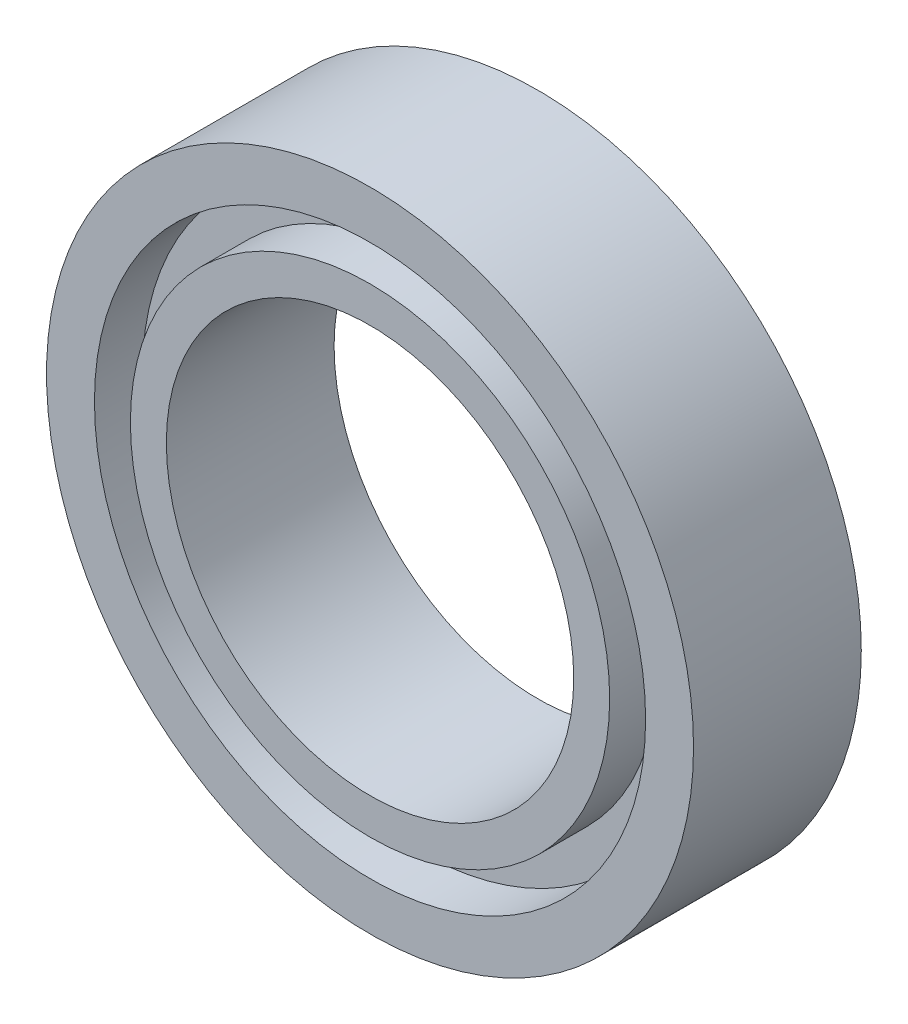
ISO-10303-21;
HEADER;
FILE_DESCRIPTION(('STEP AP214'),'2;1');
FILE_NAME('part.step','',(''),(''),'','','');
FILE_SCHEMA(('AUTOMOTIVE_DESIGN { 1 0 10303 214 1 1 1 1 }'));
ENDSEC;
DATA;
#1=APPLICATION_CONTEXT('core data for automotive mechanical design processes');
#2=APPLICATION_PROTOCOL_DEFINITION('international standard','automotive_design',2000,#1);
#3=PRODUCT_CONTEXT('',#1,'mechanical');
#4=PRODUCT('Part','Part','',(#3));
#5=PRODUCT_RELATED_PRODUCT_CATEGORY('part','',(#4));
#6=PRODUCT_DEFINITION_FORMATION('','',#4);
#7=PRODUCT_DEFINITION_CONTEXT('part definition',#1,'design');
#8=PRODUCT_DEFINITION('design','',#6,#7);
#9=PRODUCT_DEFINITION_SHAPE('','',#8);
#10=(LENGTH_UNIT() NAMED_UNIT(*) SI_UNIT(.MILLI.,.METRE.));
#11=(NAMED_UNIT(*) PLANE_ANGLE_UNIT() SI_UNIT($,.RADIAN.));
#12=(NAMED_UNIT(*) SI_UNIT($,.STERADIAN.) SOLID_ANGLE_UNIT());
#13=UNCERTAINTY_MEASURE_WITH_UNIT(LENGTH_MEASURE(1.E-05),#10,'distance_accuracy_value','');
#14=(GEOMETRIC_REPRESENTATION_CONTEXT(3) GLOBAL_UNCERTAINTY_ASSIGNED_CONTEXT((#13)) GLOBAL_UNIT_ASSIGNED_CONTEXT((#10,
#11,#12)) REPRESENTATION_CONTEXT('',''));
#15=CARTESIAN_POINT('',(0.,0.,0.));
#16=DIRECTION('',(0.,0.,1.));
#17=DIRECTION('',(1.,0.,0.));
#18=AXIS2_PLACEMENT_3D('',#15,#16,#17);
#19=CARTESIAN_POINT('',(0.,0.,7.));
#20=DIRECTION('',(0.,0.,1.));
#21=DIRECTION('',(1.,0.,0.));
#22=AXIS2_PLACEMENT_3D('',#19,#20,#21);
#23=PLANE('',#22);
#24=CARTESIAN_POINT('',(0.,0.,7.));
#25=DIRECTION('',(0.,0.,1.));
#26=DIRECTION('',(1.,0.,0.));
#27=AXIS2_PLACEMENT_3D('',#24,#25,#26);
#28=CIRCLE('',#27,8.5);
#29=CARTESIAN_POINT('',(8.5,0.,7.));
#30=VERTEX_POINT('',#29);
#31=EDGE_CURVE('E62',#30,#30,#28,.T.);
#32=ORIENTED_EDGE('',*,*,#31,.F.);
#33=EDGE_LOOP('',(#32));
#34=FACE_BOUND('',#33,.T.);
#35=CARTESIAN_POINT('',(0.,0.,7.));
#36=DIRECTION('',(0.,0.,1.));
#37=DIRECTION('',(1.,0.,0.));
#38=AXIS2_PLACEMENT_3D('',#35,#36,#37);
#39=CIRCLE('',#38,10.);
#40=CARTESIAN_POINT('',(10.,0.,7.));
#41=VERTEX_POINT('',#40);
#42=EDGE_CURVE('E80',#41,#41,#39,.T.);
#43=ORIENTED_EDGE('',*,*,#42,.T.);
#44=EDGE_LOOP('',(#43));
#45=FACE_BOUND('',#44,.T.);
#46=ADVANCED_FACE('F49',(#34,#45),#23,.T.);
#47=CARTESIAN_POINT('',(0.,0.,7.));
#48=DIRECTION('',(0.,0.,1.));
#49=DIRECTION('',(1.,0.,0.));
#50=AXIS2_PLACEMENT_3D('',#47,#48,#49);
#51=CIRCLE('',#50,11.5);
#52=CARTESIAN_POINT('',(11.5,0.,7.));
#53=VERTEX_POINT('',#52);
#54=EDGE_CURVE('E72',#53,#53,#51,.T.);
#55=ORIENTED_EDGE('',*,*,#54,.F.);
#56=EDGE_LOOP('',(#55));
#57=FACE_BOUND('',#56,.T.);
#58=CARTESIAN_POINT('',(0.,0.,7.));
#59=DIRECTION('',(0.,0.,1.));
#60=DIRECTION('',(1.,0.,0.));
#61=AXIS2_PLACEMENT_3D('',#58,#59,#60);
#62=CIRCLE('',#61,13.5);
#63=CARTESIAN_POINT('',(13.5,0.,7.));
#64=VERTEX_POINT('',#63);
#65=EDGE_CURVE('E11',#64,#64,#62,.T.);
#66=ORIENTED_EDGE('',*,*,#65,.T.);
#67=EDGE_LOOP('',(#66));
#68=FACE_BOUND('',#67,.T.);
#69=ADVANCED_FACE('F104',(#57,#68),#23,.T.);
#70=CARTESIAN_POINT('',(0.,0.,0.));
#71=DIRECTION('',(0.,0.,1.));
#72=DIRECTION('',(1.,0.,0.));
#73=AXIS2_PLACEMENT_3D('',#70,#71,#72);
#74=PLANE('',#73);
#75=CARTESIAN_POINT('',(0.,0.,0.));
#76=DIRECTION('',(0.,0.,1.));
#77=DIRECTION('',(1.,0.,0.));
#78=AXIS2_PLACEMENT_3D('',#75,#76,#77);
#79=CIRCLE('',#78,13.5);
#80=CARTESIAN_POINT('',(13.5,0.,0.));
#81=VERTEX_POINT('',#80);
#82=EDGE_CURVE('E53',#81,#81,#79,.T.);
#83=ORIENTED_EDGE('',*,*,#82,.F.);
#84=EDGE_LOOP('',(#83));
#85=FACE_BOUND('',#84,.T.);
#86=CARTESIAN_POINT('',(0.,0.,0.));
#87=DIRECTION('',(0.,0.,1.));
#88=DIRECTION('',(1.,0.,0.));
#89=AXIS2_PLACEMENT_3D('',#86,#87,#88);
#90=CIRCLE('',#89,8.5);
#91=CARTESIAN_POINT('',(8.5,0.,0.));
#92=VERTEX_POINT('',#91);
#93=EDGE_CURVE('E64',#92,#92,#90,.T.);
#94=ORIENTED_EDGE('',*,*,#93,.T.);
#95=EDGE_LOOP('',(#94));
#96=FACE_BOUND('',#95,.T.);
#97=ADVANCED_FACE('F106',(#85,#96),#74,.F.);
#98=CARTESIAN_POINT('',(0.,0.,7.));
#99=DIRECTION('',(0.,0.,-1.));
#100=DIRECTION('',(-1.,0.,0.));
#101=AXIS2_PLACEMENT_3D('',#98,#99,#100);
#102=CYLINDRICAL_SURFACE('',#101,13.5);
#103=ORIENTED_EDGE('',*,*,#65,.F.);
#104=EDGE_LOOP('',(#103));
#105=FACE_BOUND('',#104,.T.);
#106=ORIENTED_EDGE('',*,*,#82,.T.);
#107=EDGE_LOOP('',(#106));
#108=FACE_BOUND('',#107,.T.);
#109=ADVANCED_FACE('F51',(#105,#108),#102,.T.);
#110=CARTESIAN_POINT('',(0.,0.,7.));
#111=DIRECTION('',(0.,0.,-1.));
#112=DIRECTION('',(-1.,0.,0.));
#113=AXIS2_PLACEMENT_3D('',#110,#111,#112);
#114=CYLINDRICAL_SURFACE('',#113,8.5);
#115=ORIENTED_EDGE('',*,*,#31,.T.);
#116=EDGE_LOOP('',(#115));
#117=FACE_BOUND('',#116,.T.);
#118=ORIENTED_EDGE('',*,*,#93,.F.);
#119=EDGE_LOOP('',(#118));
#120=FACE_BOUND('',#119,.T.);
#121=ADVANCED_FACE('F100',(#117,#120),#114,.F.);
#122=CARTESIAN_POINT('',(0.,0.,5.));
#123=DIRECTION('',(0.,0.,1.));
#124=DIRECTION('',(1.,0.,0.));
#125=AXIS2_PLACEMENT_3D('',#122,#123,#124);
#126=CYLINDRICAL_SURFACE('',#125,11.5);
#127=CARTESIAN_POINT('',(0.,0.,5.));
#128=DIRECTION('',(0.,0.,1.));
#129=DIRECTION('',(1.,0.,0.));
#130=AXIS2_PLACEMENT_3D('',#127,#128,#129);
#131=CIRCLE('',#130,11.5);
#132=CARTESIAN_POINT('',(11.5,0.,5.));
#133=VERTEX_POINT('',#132);
#134=EDGE_CURVE('E68',#133,#133,#131,.T.);
#135=ORIENTED_EDGE('',*,*,#134,.F.);
#136=EDGE_LOOP('',(#135));
#137=FACE_BOUND('',#136,.T.);
#138=ORIENTED_EDGE('',*,*,#54,.T.);
#139=EDGE_LOOP('',(#138));
#140=FACE_BOUND('',#139,.T.);
#141=ADVANCED_FACE('F94',(#137,#140),#126,.F.);
#142=CARTESIAN_POINT('',(0.,0.,5.));
#143=DIRECTION('',(0.,0.,1.));
#144=DIRECTION('',(1.,0.,0.));
#145=AXIS2_PLACEMENT_3D('',#142,#143,#144);
#146=PLANE('',#145);
#147=CARTESIAN_POINT('',(0.,0.,5.));
#148=DIRECTION('',(0.,0.,1.));
#149=DIRECTION('',(1.,0.,0.));
#150=AXIS2_PLACEMENT_3D('',#147,#148,#149);
#151=CIRCLE('',#150,10.);
#152=CARTESIAN_POINT('',(10.,0.,5.));
#153=VERTEX_POINT('',#152);
#154=EDGE_CURVE('E76',#153,#153,#151,.T.);
#155=ORIENTED_EDGE('',*,*,#154,.F.);
#156=EDGE_LOOP('',(#155));
#157=FACE_BOUND('',#156,.T.);
#158=ORIENTED_EDGE('',*,*,#134,.T.);
#159=EDGE_LOOP('',(#158));
#160=FACE_BOUND('',#159,.T.);
#161=ADVANCED_FACE('F91',(#157,#160),#146,.T.);
#162=CARTESIAN_POINT('',(0.,0.,5.));
#163=DIRECTION('',(0.,0.,1.));
#164=DIRECTION('',(1.,0.,0.));
#165=AXIS2_PLACEMENT_3D('',#162,#163,#164);
#166=CYLINDRICAL_SURFACE('',#165,10.);
#167=ORIENTED_EDGE('',*,*,#154,.T.);
#168=EDGE_LOOP('',(#167));
#169=FACE_BOUND('',#168,.T.);
#170=ORIENTED_EDGE('',*,*,#42,.F.);
#171=EDGE_LOOP('',(#170));
#172=FACE_BOUND('',#171,.T.);
#173=ADVANCED_FACE('F88',(#169,#172),#166,.T.);
#174=CLOSED_SHELL('',(#46,#69,#97,#109,#121,#141,#161,#173));
#175=MANIFOLD_SOLID_BREP('B2',#174);
#176=ADVANCED_BREP_SHAPE_REPRESENTATION('',(#18,#175),#14);
#177=SHAPE_DEFINITION_REPRESENTATION(#9,#176);
ENDSEC;
END-ISO-10303-21;
